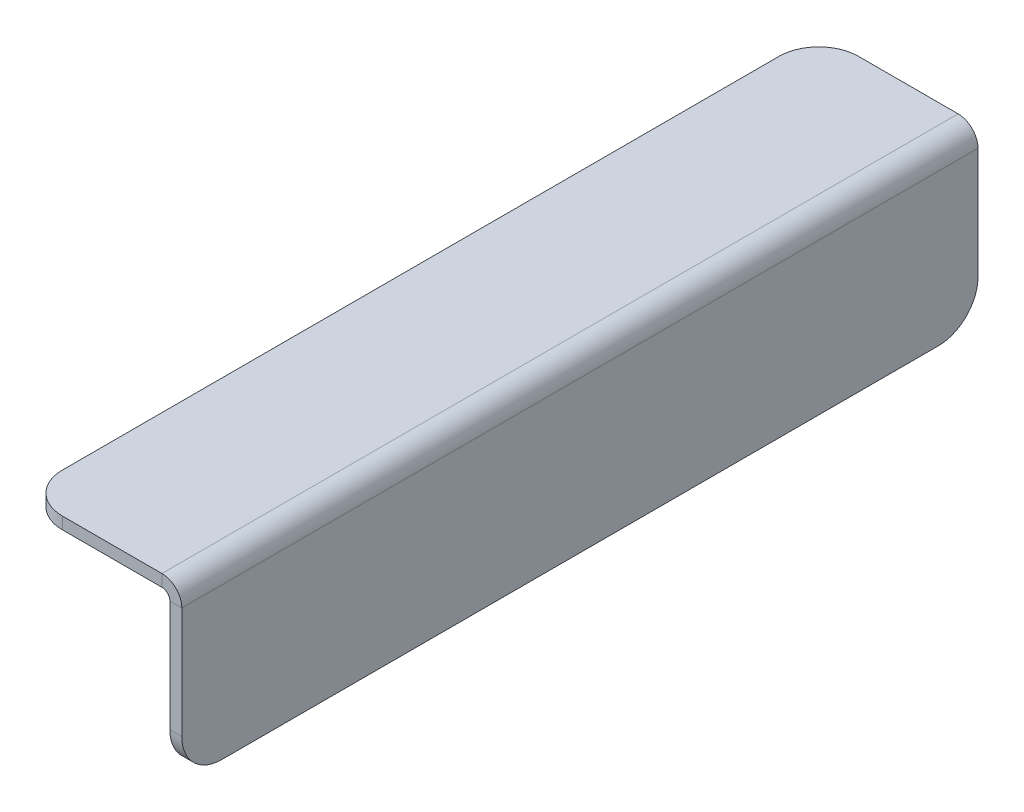
ISO-10303-21;
HEADER;
FILE_DESCRIPTION(('STEP AP214'),'2;1');
FILE_NAME('part.step','',(''),(''),'','','');
FILE_SCHEMA(('AUTOMOTIVE_DESIGN { 1 0 10303 214 1 1 1 1 }'));
ENDSEC;
DATA;
#1=APPLICATION_CONTEXT('core data for automotive mechanical design processes');
#2=APPLICATION_PROTOCOL_DEFINITION('international standard','automotive_design',2000,#1);
#3=PRODUCT_CONTEXT('',#1,'mechanical');
#4=PRODUCT('Part','Part','',(#3));
#5=PRODUCT_RELATED_PRODUCT_CATEGORY('part','',(#4));
#6=PRODUCT_DEFINITION_FORMATION('','',#4);
#7=PRODUCT_DEFINITION_CONTEXT('part definition',#1,'design');
#8=PRODUCT_DEFINITION('design','',#6,#7);
#9=PRODUCT_DEFINITION_SHAPE('','',#8);
#10=(LENGTH_UNIT() NAMED_UNIT(*) SI_UNIT(.MILLI.,.METRE.));
#11=(NAMED_UNIT(*) PLANE_ANGLE_UNIT() SI_UNIT($,.RADIAN.));
#12=(NAMED_UNIT(*) SI_UNIT($,.STERADIAN.) SOLID_ANGLE_UNIT());
#13=UNCERTAINTY_MEASURE_WITH_UNIT(LENGTH_MEASURE(1.E-05),#10,'distance_accuracy_value','');
#14=(GEOMETRIC_REPRESENTATION_CONTEXT(3) GLOBAL_UNCERTAINTY_ASSIGNED_CONTEXT((#13)) GLOBAL_UNIT_ASSIGNED_CONTEXT((#10,
#11,#12)) REPRESENTATION_CONTEXT('',''));
#15=CARTESIAN_POINT('',(0.,0.,0.));
#16=DIRECTION('',(0.,0.,1.));
#17=DIRECTION('',(1.,0.,0.));
#18=AXIS2_PLACEMENT_3D('',#15,#16,#17);
#19=CARTESIAN_POINT('',(1160.,1326.96059495753,-270.000000000001));
#20=DIRECTION('',(1.,0.,0.));
#21=DIRECTION('',(0.,1.,0.));
#22=AXIS2_PLACEMENT_3D('',#19,#20,#21);
#23=PLANE('',#22);
#24=DIRECTION('',(0.,1.,0.));
#25=VECTOR('',#24,1.);
#26=CARTESIAN_POINT('',(1160.,1326.96059495753,-275.000000000001));
#27=LINE('',#26,#25);
#28=CARTESIAN_POINT('',(1160.,1528.5,-275.000000000001));
#29=VERTEX_POINT('',#28);
#30=CARTESIAN_POINT('',(1160.,1530.,-275.000000000001));
#31=VERTEX_POINT('',#30);
#32=EDGE_CURVE('E170',#29,#31,#27,.T.);
#33=ORIENTED_EDGE('',*,*,#32,.T.);
#34=DIRECTION('',(0.,0.,1.));
#35=VECTOR('',#34,1.);
#36=CARTESIAN_POINT('',(1160.,1530.,-270.000000000001));
#37=LINE('',#36,#35);
#38=CARTESIAN_POINT('',(1160.,1530.,-365.000000000001));
#39=VERTEX_POINT('',#38);
#40=EDGE_CURVE('E250',#31,#39,#37,.F.);
#41=ORIENTED_EDGE('',*,*,#40,.T.);
#42=DIRECTION('',(0.,1.,0.));
#43=VECTOR('',#42,1.);
#44=CARTESIAN_POINT('',(1160.,1326.96059495753,-365.000000000001));
#45=LINE('',#44,#43);
#46=CARTESIAN_POINT('',(1160.,1528.5,-365.000000000001));
#47=VERTEX_POINT('',#46);
#48=EDGE_CURVE('E247',#47,#39,#45,.T.);
#49=ORIENTED_EDGE('',*,*,#48,.F.);
#50=DIRECTION('',(0.,0.,-1.));
#51=VECTOR('',#50,1.);
#52=CARTESIAN_POINT('',(1160.,1528.5,-270.000000000001));
#53=LINE('',#52,#51);
#54=EDGE_CURVE('E235',#29,#47,#53,.T.);
#55=ORIENTED_EDGE('',*,*,#54,.F.);
#56=EDGE_LOOP('',(#33,#41,#49,#55));
#57=FACE_BOUND('',#56,.T.);
#58=ADVANCED_FACE('F42',(#57),#23,.F.);
#59=CARTESIAN_POINT('',(1165.,1326.96059495753,-365.000000000001));
#60=DIRECTION('',(0.,1.,0.));
#61=DIRECTION('',(-1.,0.,0.));
#62=AXIS2_PLACEMENT_3D('',#59,#60,#61);
#63=CYLINDRICAL_SURFACE('',#62,5.);
#64=ORIENTED_EDGE('',*,*,#48,.T.);
#65=CARTESIAN_POINT('',(1165.,1530.,-365.000000000001));
#66=DIRECTION('',(0.,1.,0.));
#67=DIRECTION('',(0.,0.,1.));
#68=AXIS2_PLACEMENT_3D('',#65,#66,#67);
#69=CIRCLE('',#68,5.);
#70=CARTESIAN_POINT('',(1165.,1530.,-370.000000000001));
#71=VERTEX_POINT('',#70);
#72=EDGE_CURVE('E244',#39,#71,#69,.F.);
#73=ORIENTED_EDGE('',*,*,#72,.T.);
#74=DIRECTION('',(0.,1.,0.));
#75=VECTOR('',#74,1.);
#76=CARTESIAN_POINT('',(1165.,1326.96059495753,-370.000000000001));
#77=LINE('',#76,#75);
#78=CARTESIAN_POINT('',(1165.,1528.5,-370.000000000001));
#79=VERTEX_POINT('',#78);
#80=EDGE_CURVE('E161',#79,#71,#77,.T.);
#81=ORIENTED_EDGE('',*,*,#80,.F.);
#82=CARTESIAN_POINT('',(1165.,1528.5,-365.000000000001));
#83=DIRECTION('',(0.,1.,0.));
#84=DIRECTION('',(0.,0.,1.));
#85=AXIS2_PLACEMENT_3D('',#82,#83,#84);
#86=CIRCLE('',#85,5.);
#87=EDGE_CURVE('E232',#47,#79,#86,.F.);
#88=ORIENTED_EDGE('',*,*,#87,.F.);
#89=EDGE_LOOP('',(#64,#73,#81,#88));
#90=FACE_BOUND('',#89,.T.);
#91=ADVANCED_FACE('F291',(#90),#63,.T.);
#92=CARTESIAN_POINT('',(1165.,1326.96059495753,-275.000000000001));
#93=DIRECTION('',(0.,1.,0.));
#94=DIRECTION('',(-1.,0.,0.));
#95=AXIS2_PLACEMENT_3D('',#92,#93,#94);
#96=CYLINDRICAL_SURFACE('',#95,5.);
#97=DIRECTION('',(0.,1.,0.));
#98=VECTOR('',#97,1.);
#99=CARTESIAN_POINT('',(1165.,1326.96059495753,-270.000000000001));
#100=LINE('',#99,#98);
#101=CARTESIAN_POINT('',(1165.,1528.5,-270.000000000001));
#102=VERTEX_POINT('',#101);
#103=CARTESIAN_POINT('',(1165.,1530.,-270.000000000001));
#104=VERTEX_POINT('',#103);
#105=EDGE_CURVE('E242',#102,#104,#100,.T.);
#106=ORIENTED_EDGE('',*,*,#105,.T.);
#107=CARTESIAN_POINT('',(1165.,1530.,-275.000000000001));
#108=DIRECTION('',(0.,1.,0.));
#109=DIRECTION('',(0.,0.,1.));
#110=AXIS2_PLACEMENT_3D('',#107,#108,#109);
#111=CIRCLE('',#110,5.);
#112=EDGE_CURVE('E154',#104,#31,#111,.F.);
#113=ORIENTED_EDGE('',*,*,#112,.T.);
#114=ORIENTED_EDGE('',*,*,#32,.F.);
#115=CARTESIAN_POINT('',(1165.,1528.5,-275.000000000001));
#116=DIRECTION('',(0.,1.,0.));
#117=DIRECTION('',(0.,0.,1.));
#118=AXIS2_PLACEMENT_3D('',#115,#116,#117);
#119=CIRCLE('',#118,5.);
#120=EDGE_CURVE('E11',#102,#29,#119,.F.);
#121=ORIENTED_EDGE('',*,*,#120,.F.);
#122=EDGE_LOOP('',(#106,#113,#114,#121));
#123=FACE_BOUND('',#122,.T.);
#124=ADVANCED_FACE('F258',(#123),#96,.T.);
#125=CARTESIAN_POINT('',(1178.5,1326.96059495753,-270.000000000001));
#126=DIRECTION('',(0.,0.,-1.));
#127=DIRECTION('',(0.,-1.,0.));
#128=AXIS2_PLACEMENT_3D('',#125,#126,#127);
#129=PLANE('',#128);
#130=DIRECTION('',(0.,1.,0.));
#131=VECTOR('',#130,1.);
#132=CARTESIAN_POINT('',(1177.5,1326.96059495753,-270.000000000001));
#133=LINE('',#132,#131);
#134=CARTESIAN_POINT('',(1177.5,1528.5,-270.000000000001));
#135=VERTEX_POINT('',#134);
#136=CARTESIAN_POINT('',(1177.5,1530.,-270.000000000001));
#137=VERTEX_POINT('',#136);
#138=EDGE_CURVE('E146',#135,#137,#133,.T.);
#139=ORIENTED_EDGE('',*,*,#138,.T.);
#140=DIRECTION('',(1.,0.,0.));
#141=VECTOR('',#140,1.);
#142=CARTESIAN_POINT('',(1180.,1530.,-270.000000000001));
#143=LINE('',#142,#141);
#144=EDGE_CURVE('E149',#137,#104,#143,.F.);
#145=ORIENTED_EDGE('',*,*,#144,.T.);
#146=ORIENTED_EDGE('',*,*,#105,.F.);
#147=DIRECTION('',(1.,0.,0.));
#148=VECTOR('',#147,1.);
#149=CARTESIAN_POINT('',(1178.5,1528.5,-270.000000000001));
#150=LINE('',#149,#148);
#151=EDGE_CURVE('E52',#135,#102,#150,.F.);
#152=ORIENTED_EDGE('',*,*,#151,.F.);
#153=EDGE_LOOP('',(#139,#145,#146,#152));
#154=FACE_BOUND('',#153,.T.);
#155=ADVANCED_FACE('F148',(#154),#129,.F.);
#156=CARTESIAN_POINT('',(1178.5,1530.,-270.000000000001));
#157=DIRECTION('',(0.,-1.,0.));
#158=DIRECTION('',(0.,0.,-1.));
#159=AXIS2_PLACEMENT_3D('',#156,#157,#158);
#160=PLANE('',#159);
#161=ORIENTED_EDGE('',*,*,#144,.F.);
#162=DIRECTION('',(0.,0.,-1.));
#163=VECTOR('',#162,1.);
#164=CARTESIAN_POINT('',(1177.5,1530.,-270.000000000001));
#165=LINE('',#164,#163);
#166=CARTESIAN_POINT('',(1177.5,1530.,-370.000000000001));
#167=VERTEX_POINT('',#166);
#168=EDGE_CURVE('E159',#167,#137,#165,.F.);
#169=ORIENTED_EDGE('',*,*,#168,.F.);
#170=DIRECTION('',(-1.,0.,0.));
#171=VECTOR('',#170,1.);
#172=CARTESIAN_POINT('',(1177.5,1530.,-370.000000000001));
#173=LINE('',#172,#171);
#174=EDGE_CURVE('E238',#71,#167,#173,.F.);
#175=ORIENTED_EDGE('',*,*,#174,.F.);
#176=ORIENTED_EDGE('',*,*,#72,.F.);
#177=ORIENTED_EDGE('',*,*,#40,.F.);
#178=ORIENTED_EDGE('',*,*,#112,.F.);
#179=EDGE_LOOP('',(#161,#169,#175,#176,#177,#178));
#180=FACE_BOUND('',#179,.T.);
#181=ADVANCED_FACE('F158',(#180),#160,.F.);
#182=CARTESIAN_POINT('',(1178.5,1326.96059495753,-370.000000000001));
#183=DIRECTION('',(0.,0.,1.));
#184=DIRECTION('',(0.,1.,0.));
#185=AXIS2_PLACEMENT_3D('',#182,#183,#184);
#186=PLANE('',#185);
#187=ORIENTED_EDGE('',*,*,#80,.T.);
#188=ORIENTED_EDGE('',*,*,#174,.T.);
#189=DIRECTION('',(0.,1.,0.));
#190=VECTOR('',#189,1.);
#191=CARTESIAN_POINT('',(1177.5,1326.96059495753,-370.000000000001));
#192=LINE('',#191,#190);
#193=CARTESIAN_POINT('',(1177.5,1528.5,-370.000000000001));
#194=VERTEX_POINT('',#193);
#195=EDGE_CURVE('E46',#194,#167,#192,.T.);
#196=ORIENTED_EDGE('',*,*,#195,.F.);
#197=DIRECTION('',(1.,0.,0.));
#198=VECTOR('',#197,1.);
#199=CARTESIAN_POINT('',(1178.5,1528.5,-370.000000000001));
#200=LINE('',#199,#198);
#201=EDGE_CURVE('E61',#79,#194,#200,.T.);
#202=ORIENTED_EDGE('',*,*,#201,.F.);
#203=EDGE_LOOP('',(#187,#188,#196,#202));
#204=FACE_BOUND('',#203,.T.);
#205=ADVANCED_FACE('F305',(#204),#186,.F.);
#206=CARTESIAN_POINT('',(1178.5,1528.5,-270.000000000001));
#207=DIRECTION('',(0.,-1.,0.));
#208=DIRECTION('',(0.,0.,-1.));
#209=AXIS2_PLACEMENT_3D('',#206,#207,#208);
#210=PLANE('',#209);
#211=ORIENTED_EDGE('',*,*,#54,.T.);
#212=ORIENTED_EDGE('',*,*,#87,.T.);
#213=ORIENTED_EDGE('',*,*,#201,.T.);
#214=DIRECTION('',(0.,0.,-1.));
#215=VECTOR('',#214,1.);
#216=CARTESIAN_POINT('',(1177.5,1528.5,-270.000000000001));
#217=LINE('',#216,#215);
#218=EDGE_CURVE('E229',#194,#135,#217,.F.);
#219=ORIENTED_EDGE('',*,*,#218,.T.);
#220=ORIENTED_EDGE('',*,*,#151,.T.);
#221=ORIENTED_EDGE('',*,*,#120,.T.);
#222=EDGE_LOOP('',(#211,#212,#213,#219,#220,#221));
#223=FACE_BOUND('',#222,.T.);
#224=ADVANCED_FACE('F44',(#223),#210,.T.);
#225=CARTESIAN_POINT('',(1180.,1513.5,-270.000000000001));
#226=DIRECTION('',(-1.,0.,0.));
#227=DIRECTION('',(0.,0.,1.));
#228=AXIS2_PLACEMENT_3D('',#225,#226,#227);
#229=PLANE('',#228);
#230=DIRECTION('',(0.,0.,1.));
#231=VECTOR('',#230,1.);
#232=CARTESIAN_POINT('',(1180.,1508.5,-270.000000000001));
#233=LINE('',#232,#231);
#234=CARTESIAN_POINT('',(1180.,1508.5,-365.000000000001));
#235=VERTEX_POINT('',#234);
#236=CARTESIAN_POINT('',(1180.,1508.5,-275.000000000001));
#237=VERTEX_POINT('',#236);
#238=EDGE_CURVE('E175',#235,#237,#233,.T.);
#239=ORIENTED_EDGE('',*,*,#238,.F.);
#240=CARTESIAN_POINT('',(1180.,1513.5,-365.000000000001));
#241=DIRECTION('',(-1.,0.,0.));
#242=DIRECTION('',(0.,0.,1.));
#243=AXIS2_PLACEMENT_3D('',#240,#241,#242);
#244=CIRCLE('',#243,5.);
#245=CARTESIAN_POINT('',(1180.,1513.5,-370.000000000001));
#246=VERTEX_POINT('',#245);
#247=EDGE_CURVE('E183',#246,#235,#244,.T.);
#248=ORIENTED_EDGE('',*,*,#247,.F.);
#249=DIRECTION('',(0.,1.,0.));
#250=VECTOR('',#249,1.);
#251=CARTESIAN_POINT('',(1180.,1527.5,-370.000000000001));
#252=LINE('',#251,#250);
#253=CARTESIAN_POINT('',(1180.,1527.5,-370.000000000001));
#254=VERTEX_POINT('',#253);
#255=EDGE_CURVE('E186',#254,#246,#252,.F.);
#256=ORIENTED_EDGE('',*,*,#255,.F.);
#257=DIRECTION('',(0.,0.,-1.));
#258=VECTOR('',#257,1.);
#259=CARTESIAN_POINT('',(1180.,1527.5,-270.000000000001));
#260=LINE('',#259,#258);
#261=CARTESIAN_POINT('',(1180.,1527.5,-270.000000000001));
#262=VERTEX_POINT('',#261);
#263=EDGE_CURVE('E189',#262,#254,#260,.T.);
#264=ORIENTED_EDGE('',*,*,#263,.F.);
#265=DIRECTION('',(0.,1.,0.));
#266=VECTOR('',#265,1.);
#267=CARTESIAN_POINT('',(1180.,1527.5,-270.000000000001));
#268=LINE('',#267,#266);
#269=CARTESIAN_POINT('',(1180.,1513.5,-270.000000000001));
#270=VERTEX_POINT('',#269);
#271=EDGE_CURVE('E104',#270,#262,#268,.T.);
#272=ORIENTED_EDGE('',*,*,#271,.F.);
#273=CARTESIAN_POINT('',(1180.,1513.5,-275.000000000001));
#274=DIRECTION('',(1.,0.,0.));
#275=DIRECTION('',(0.,0.,-1.));
#276=AXIS2_PLACEMENT_3D('',#273,#274,#275);
#277=CIRCLE('',#276,5.);
#278=EDGE_CURVE('E192',#237,#270,#277,.F.);
#279=ORIENTED_EDGE('',*,*,#278,.F.);
#280=EDGE_LOOP('',(#239,#248,#256,#264,#272,#279));
#281=FACE_BOUND('',#280,.T.);
#282=ADVANCED_FACE('F275',(#281),#229,.F.);
#283=CARTESIAN_POINT('',(976.422005118431,1527.5,-270.000000000001));
#284=DIRECTION('',(0.,0.,1.));
#285=DIRECTION('',(1.,0.,0.));
#286=AXIS2_PLACEMENT_3D('',#283,#284,#285);
#287=PLANE('',#286);
#288=ORIENTED_EDGE('',*,*,#271,.T.);
#289=DIRECTION('',(1.,0.,0.));
#290=VECTOR('',#289,1.);
#291=CARTESIAN_POINT('',(976.422005118431,1527.5,-270.000000000001));
#292=LINE('',#291,#290);
#293=CARTESIAN_POINT('',(1178.5,1527.5,-270.000000000001));
#294=VERTEX_POINT('',#293);
#295=EDGE_CURVE('E173',#294,#262,#292,.T.);
#296=ORIENTED_EDGE('',*,*,#295,.F.);
#297=DIRECTION('',(0.,1.,0.));
#298=VECTOR('',#297,1.);
#299=CARTESIAN_POINT('',(1178.5,1527.5,-270.000000000001));
#300=LINE('',#299,#298);
#301=CARTESIAN_POINT('',(1178.5,1513.5,-270.000000000001));
#302=VERTEX_POINT('',#301);
#303=EDGE_CURVE('E194',#294,#302,#300,.F.);
#304=ORIENTED_EDGE('',*,*,#303,.T.);
#305=DIRECTION('',(1.,0.,0.));
#306=VECTOR('',#305,1.);
#307=CARTESIAN_POINT('',(976.422005118431,1513.5,-270.000000000001));
#308=LINE('',#307,#306);
#309=EDGE_CURVE('E212',#302,#270,#308,.T.);
#310=ORIENTED_EDGE('',*,*,#309,.T.);
#311=EDGE_LOOP('',(#288,#296,#304,#310));
#312=FACE_BOUND('',#311,.T.);
#313=ADVANCED_FACE('F271',(#312),#287,.T.);
#314=CARTESIAN_POINT('',(976.422005118431,1527.5,-370.000000000001));
#315=DIRECTION('',(0.,0.,-1.));
#316=DIRECTION('',(-1.,0.,0.));
#317=AXIS2_PLACEMENT_3D('',#314,#315,#316);
#318=PLANE('',#317);
#319=ORIENTED_EDGE('',*,*,#255,.T.);
#320=DIRECTION('',(1.,0.,0.));
#321=VECTOR('',#320,1.);
#322=CARTESIAN_POINT('',(976.422005118431,1513.5,-370.000000000001));
#323=LINE('',#322,#321);
#324=CARTESIAN_POINT('',(1178.5,1513.5,-370.000000000001));
#325=VERTEX_POINT('',#324);
#326=EDGE_CURVE('E221',#325,#246,#323,.T.);
#327=ORIENTED_EDGE('',*,*,#326,.F.);
#328=DIRECTION('',(0.,1.,0.));
#329=VECTOR('',#328,1.);
#330=CARTESIAN_POINT('',(1178.5,1527.5,-370.000000000001));
#331=LINE('',#330,#329);
#332=CARTESIAN_POINT('',(1178.5,1527.5,-370.000000000001));
#333=VERTEX_POINT('',#332);
#334=EDGE_CURVE('E200',#325,#333,#331,.T.);
#335=ORIENTED_EDGE('',*,*,#334,.T.);
#336=DIRECTION('',(1.,0.,0.));
#337=VECTOR('',#336,1.);
#338=CARTESIAN_POINT('',(976.422005118431,1527.5,-370.000000000001));
#339=LINE('',#338,#337);
#340=EDGE_CURVE('E224',#333,#254,#339,.T.);
#341=ORIENTED_EDGE('',*,*,#340,.T.);
#342=EDGE_LOOP('',(#319,#327,#335,#341));
#343=FACE_BOUND('',#342,.T.);
#344=ADVANCED_FACE('F266',(#343),#318,.T.);
#345=CARTESIAN_POINT('',(976.422005118431,1513.5,-365.000000000001));
#346=DIRECTION('',(1.,0.,0.));
#347=DIRECTION('',(0.,0.,-1.));
#348=AXIS2_PLACEMENT_3D('',#345,#346,#347);
#349=CYLINDRICAL_SURFACE('',#348,5.);
#350=ORIENTED_EDGE('',*,*,#326,.T.);
#351=ORIENTED_EDGE('',*,*,#247,.T.);
#352=DIRECTION('',(1.,0.,0.));
#353=VECTOR('',#352,1.);
#354=CARTESIAN_POINT('',(976.422005118431,1508.5,-365.000000000001));
#355=LINE('',#354,#353);
#356=CARTESIAN_POINT('',(1178.5,1508.5,-365.000000000001));
#357=VERTEX_POINT('',#356);
#358=EDGE_CURVE('E218',#357,#235,#355,.T.);
#359=ORIENTED_EDGE('',*,*,#358,.F.);
#360=CARTESIAN_POINT('',(1178.5,1513.5,-365.000000000001));
#361=DIRECTION('',(-1.,0.,0.));
#362=DIRECTION('',(0.,0.,1.));
#363=AXIS2_PLACEMENT_3D('',#360,#361,#362);
#364=CIRCLE('',#363,5.);
#365=EDGE_CURVE('E203',#325,#357,#364,.T.);
#366=ORIENTED_EDGE('',*,*,#365,.F.);
#367=EDGE_LOOP('',(#350,#351,#359,#366));
#368=FACE_BOUND('',#367,.T.);
#369=ADVANCED_FACE('F280',(#368),#349,.T.);
#370=CARTESIAN_POINT('',(976.422005118431,1508.5,-270.000000000001));
#371=DIRECTION('',(0.,1.,0.));
#372=DIRECTION('',(0.,0.,1.));
#373=AXIS2_PLACEMENT_3D('',#370,#371,#372);
#374=PLANE('',#373);
#375=ORIENTED_EDGE('',*,*,#358,.T.);
#376=ORIENTED_EDGE('',*,*,#238,.T.);
#377=DIRECTION('',(1.,0.,0.));
#378=VECTOR('',#377,1.);
#379=CARTESIAN_POINT('',(976.422005118431,1508.5,-275.000000000001));
#380=LINE('',#379,#378);
#381=CARTESIAN_POINT('',(1178.5,1508.5,-275.000000000001));
#382=VERTEX_POINT('',#381);
#383=EDGE_CURVE('E215',#382,#237,#380,.T.);
#384=ORIENTED_EDGE('',*,*,#383,.F.);
#385=DIRECTION('',(0.,0.,1.));
#386=VECTOR('',#385,1.);
#387=CARTESIAN_POINT('',(1178.5,1508.5,-270.000000000001));
#388=LINE('',#387,#386);
#389=EDGE_CURVE('E206',#357,#382,#388,.T.);
#390=ORIENTED_EDGE('',*,*,#389,.F.);
#391=EDGE_LOOP('',(#375,#376,#384,#390));
#392=FACE_BOUND('',#391,.T.);
#393=ADVANCED_FACE('F277',(#392),#374,.F.);
#394=CARTESIAN_POINT('',(976.422005118431,1513.5,-275.000000000001));
#395=DIRECTION('',(1.,0.,0.));
#396=DIRECTION('',(0.,0.,-1.));
#397=AXIS2_PLACEMENT_3D('',#394,#395,#396);
#398=CYLINDRICAL_SURFACE('',#397,5.);
#399=ORIENTED_EDGE('',*,*,#383,.T.);
#400=ORIENTED_EDGE('',*,*,#278,.T.);
#401=ORIENTED_EDGE('',*,*,#309,.F.);
#402=CARTESIAN_POINT('',(1178.5,1513.5,-275.000000000001));
#403=DIRECTION('',(1.,0.,0.));
#404=DIRECTION('',(0.,0.,-1.));
#405=AXIS2_PLACEMENT_3D('',#402,#403,#404);
#406=CIRCLE('',#405,5.);
#407=EDGE_CURVE('E209',#382,#302,#406,.F.);
#408=ORIENTED_EDGE('',*,*,#407,.F.);
#409=EDGE_LOOP('',(#399,#400,#401,#408));
#410=FACE_BOUND('',#409,.T.);
#411=ADVANCED_FACE('F273',(#410),#398,.T.);
#412=CARTESIAN_POINT('',(1178.5,1513.5,-270.000000000001));
#413=DIRECTION('',(-1.,0.,0.));
#414=DIRECTION('',(0.,0.,1.));
#415=AXIS2_PLACEMENT_3D('',#412,#413,#414);
#416=PLANE('',#415);
#417=ORIENTED_EDGE('',*,*,#303,.F.);
#418=DIRECTION('',(0.,0.,-1.));
#419=VECTOR('',#418,1.);
#420=CARTESIAN_POINT('',(1178.5,1527.5,-270.000000000001));
#421=LINE('',#420,#419);
#422=EDGE_CURVE('E197',#294,#333,#421,.T.);
#423=ORIENTED_EDGE('',*,*,#422,.T.);
#424=ORIENTED_EDGE('',*,*,#334,.F.);
#425=ORIENTED_EDGE('',*,*,#365,.T.);
#426=ORIENTED_EDGE('',*,*,#389,.T.);
#427=ORIENTED_EDGE('',*,*,#407,.T.);
#428=EDGE_LOOP('',(#417,#423,#424,#425,#426,#427));
#429=FACE_BOUND('',#428,.T.);
#430=ADVANCED_FACE('F269',(#429),#416,.T.);
#431=CARTESIAN_POINT('',(1177.5,1527.5,-370.000000000001));
#432=DIRECTION('',(0.,0.,-1.));
#433=DIRECTION('',(-1.,0.,0.));
#434=AXIS2_PLACEMENT_3D('',#431,#432,#433);
#435=PLANE('',#434);
#436=ORIENTED_EDGE('',*,*,#340,.F.);
#437=CARTESIAN_POINT('',(1177.5,1527.5,-370.000000000001));
#438=DIRECTION('',(0.,0.,-1.));
#439=DIRECTION('',(-1.,0.,0.));
#440=AXIS2_PLACEMENT_3D('',#437,#438,#439);
#441=CIRCLE('',#440,0.999999999999798);
#442=EDGE_CURVE('E112',#333,#194,#441,.F.);
#443=ORIENTED_EDGE('',*,*,#442,.T.);
#444=ORIENTED_EDGE('',*,*,#195,.T.);
#445=CARTESIAN_POINT('',(1177.5,1527.5,-370.000000000001));
#446=DIRECTION('',(0.,0.,-1.));
#447=DIRECTION('',(-1.,0.,0.));
#448=AXIS2_PLACEMENT_3D('',#445,#446,#447);
#449=CIRCLE('',#448,2.49999999999985);
#450=EDGE_CURVE('E169',#254,#167,#449,.F.);
#451=ORIENTED_EDGE('',*,*,#450,.F.);
#452=EDGE_LOOP('',(#436,#443,#444,#451));
#453=FACE_BOUND('',#452,.T.);
#454=ADVANCED_FACE('F262',(#453),#435,.T.);
#455=CARTESIAN_POINT('',(1177.5,1527.5,-270.000000000001));
#456=DIRECTION('',(0.,0.,1.));
#457=DIRECTION('',(1.,0.,0.));
#458=AXIS2_PLACEMENT_3D('',#455,#456,#457);
#459=PLANE('',#458);
#460=ORIENTED_EDGE('',*,*,#138,.F.);
#461=CARTESIAN_POINT('',(1177.5,1527.5,-270.000000000001));
#462=DIRECTION('',(0.,0.,-1.));
#463=DIRECTION('',(-1.,0.,0.));
#464=AXIS2_PLACEMENT_3D('',#461,#462,#463);
#465=CIRCLE('',#464,0.999999999999798);
#466=EDGE_CURVE('E177',#135,#294,#465,.T.);
#467=ORIENTED_EDGE('',*,*,#466,.T.);
#468=ORIENTED_EDGE('',*,*,#295,.T.);
#469=CARTESIAN_POINT('',(1177.5,1527.5,-270.000000000001));
#470=DIRECTION('',(0.,0.,-1.));
#471=DIRECTION('',(-1.,0.,0.));
#472=AXIS2_PLACEMENT_3D('',#469,#470,#471);
#473=CIRCLE('',#472,2.49999999999985);
#474=EDGE_CURVE('E168',#137,#262,#473,.T.);
#475=ORIENTED_EDGE('',*,*,#474,.F.);
#476=EDGE_LOOP('',(#460,#467,#468,#475));
#477=FACE_BOUND('',#476,.T.);
#478=ADVANCED_FACE('F171',(#477),#459,.T.);
#479=CARTESIAN_POINT('',(1177.5,1527.5,-162.653598104082));
#480=DIRECTION('',(0.,0.,-1.));
#481=DIRECTION('',(-1.,0.,0.));
#482=AXIS2_PLACEMENT_3D('',#479,#480,#481);
#483=CYLINDRICAL_SURFACE('',#482,2.49999999999985);
#484=ORIENTED_EDGE('',*,*,#474,.T.);
#485=ORIENTED_EDGE('',*,*,#263,.T.);
#486=ORIENTED_EDGE('',*,*,#450,.T.);
#487=ORIENTED_EDGE('',*,*,#168,.T.);
#488=EDGE_LOOP('',(#484,#485,#486,#487));
#489=FACE_BOUND('',#488,.T.);
#490=ADVANCED_FACE('F166',(#489),#483,.T.);
#491=CARTESIAN_POINT('',(1177.5,1527.5,-162.653598104082));
#492=DIRECTION('',(0.,0.,-1.));
#493=DIRECTION('',(-1.,0.,0.));
#494=AXIS2_PLACEMENT_3D('',#491,#492,#493);
#495=CYLINDRICAL_SURFACE('',#494,0.999999999999798);
#496=ORIENTED_EDGE('',*,*,#466,.F.);
#497=ORIENTED_EDGE('',*,*,#218,.F.);
#498=ORIENTED_EDGE('',*,*,#442,.F.);
#499=ORIENTED_EDGE('',*,*,#422,.F.);
#500=EDGE_LOOP('',(#496,#497,#498,#499));
#501=FACE_BOUND('',#500,.T.);
#502=ADVANCED_FACE('F260',(#501),#495,.F.);
#503=CLOSED_SHELL('',(#58,#91,#124,#155,#181,#205,#224,#282,#313,#344,#369,#393,#411,#430,#454,
#478,#490,#502));
#504=MANIFOLD_SOLID_BREP('B2',#503);
#505=ADVANCED_BREP_SHAPE_REPRESENTATION('',(#18,#504),#14);
#506=SHAPE_DEFINITION_REPRESENTATION(#9,#505);
ENDSEC;
END-ISO-10303-21;
